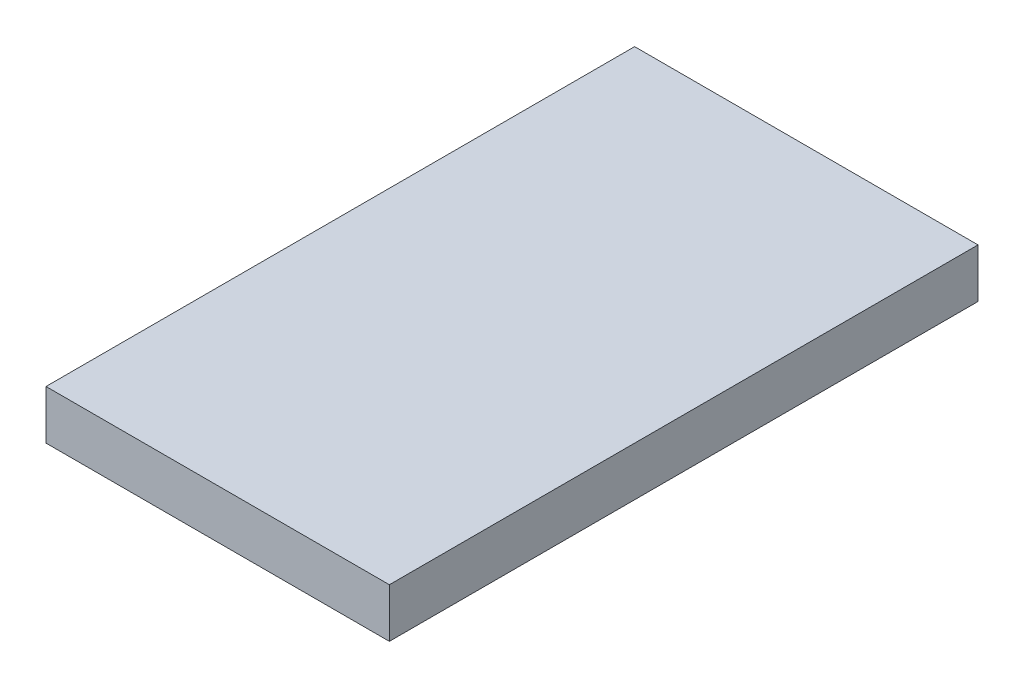
ISO-10303-21;
HEADER;
FILE_DESCRIPTION(('STEP AP214'),'2;1');
FILE_NAME('part.step','',(''),(''),'','','');
FILE_SCHEMA(('AUTOMOTIVE_DESIGN { 1 0 10303 214 1 1 1 1 }'));
ENDSEC;
DATA;
#1=APPLICATION_CONTEXT('core data for automotive mechanical design processes');
#2=APPLICATION_PROTOCOL_DEFINITION('international standard','automotive_design',2000,#1);
#3=PRODUCT_CONTEXT('',#1,'mechanical');
#4=PRODUCT('Part','Part','',(#3));
#5=PRODUCT_RELATED_PRODUCT_CATEGORY('part','',(#4));
#6=PRODUCT_DEFINITION_FORMATION('','',#4);
#7=PRODUCT_DEFINITION_CONTEXT('part definition',#1,'design');
#8=PRODUCT_DEFINITION('design','',#6,#7);
#9=PRODUCT_DEFINITION_SHAPE('','',#8);
#10=(LENGTH_UNIT() NAMED_UNIT(*) SI_UNIT(.MILLI.,.METRE.));
#11=(NAMED_UNIT(*) PLANE_ANGLE_UNIT() SI_UNIT($,.RADIAN.));
#12=(NAMED_UNIT(*) SI_UNIT($,.STERADIAN.) SOLID_ANGLE_UNIT());
#13=UNCERTAINTY_MEASURE_WITH_UNIT(LENGTH_MEASURE(1.E-05),#10,'distance_accuracy_value','');
#14=(GEOMETRIC_REPRESENTATION_CONTEXT(3) GLOBAL_UNCERTAINTY_ASSIGNED_CONTEXT((#13)) GLOBAL_UNIT_ASSIGNED_CONTEXT((#10,
#11,#12)) REPRESENTATION_CONTEXT('',''));
#15=CARTESIAN_POINT('',(0.,0.,0.));
#16=DIRECTION('',(0.,0.,1.));
#17=DIRECTION('',(1.,0.,0.));
#18=AXIS2_PLACEMENT_3D('',#15,#16,#17);
#19=CARTESIAN_POINT('',(21.,6.,-36.));
#20=DIRECTION('',(-1.,0.,0.));
#21=DIRECTION('',(0.,0.,1.));
#22=AXIS2_PLACEMENT_3D('',#19,#20,#21);
#23=PLANE('',#22);
#24=DIRECTION('',(0.,0.,-1.));
#25=VECTOR('',#24,1.);
#26=CARTESIAN_POINT('',(21.,0.,-36.));
#27=LINE('',#26,#25);
#28=CARTESIAN_POINT('',(21.,0.,36.));
#29=VERTEX_POINT('',#28);
#30=CARTESIAN_POINT('',(21.,0.,-36.));
#31=VERTEX_POINT('',#30);
#32=EDGE_CURVE('E96',#29,#31,#27,.T.);
#33=ORIENTED_EDGE('',*,*,#32,.T.);
#34=DIRECTION('',(0.,-1.,0.));
#35=VECTOR('',#34,1.);
#36=CARTESIAN_POINT('',(21.,6.,-36.));
#37=LINE('',#36,#35);
#38=CARTESIAN_POINT('',(21.,6.,-36.));
#39=VERTEX_POINT('',#38);
#40=EDGE_CURVE('E11',#39,#31,#37,.T.);
#41=ORIENTED_EDGE('',*,*,#40,.F.);
#42=DIRECTION('',(0.,0.,-1.));
#43=VECTOR('',#42,1.);
#44=CARTESIAN_POINT('',(21.,6.,-36.));
#45=LINE('',#44,#43);
#46=CARTESIAN_POINT('',(21.,6.,36.));
#47=VERTEX_POINT('',#46);
#48=EDGE_CURVE('E84',#47,#39,#45,.T.);
#49=ORIENTED_EDGE('',*,*,#48,.F.);
#50=DIRECTION('',(0.,-1.,0.));
#51=VECTOR('',#50,1.);
#52=CARTESIAN_POINT('',(21.,6.,36.));
#53=LINE('',#52,#51);
#54=EDGE_CURVE('E92',#47,#29,#53,.T.);
#55=ORIENTED_EDGE('',*,*,#54,.T.);
#56=EDGE_LOOP('',(#33,#41,#49,#55));
#57=FACE_BOUND('',#56,.T.);
#58=ADVANCED_FACE('F33',(#57),#23,.F.);
#59=CARTESIAN_POINT('',(-21.,6.,-36.));
#60=DIRECTION('',(0.,0.,1.));
#61=DIRECTION('',(1.,0.,0.));
#62=AXIS2_PLACEMENT_3D('',#59,#60,#61);
#63=PLANE('',#62);
#64=DIRECTION('',(-1.,0.,0.));
#65=VECTOR('',#64,1.);
#66=CARTESIAN_POINT('',(-21.,0.,-36.));
#67=LINE('',#66,#65);
#68=CARTESIAN_POINT('',(-21.,0.,-36.));
#69=VERTEX_POINT('',#68);
#70=EDGE_CURVE('E88',#31,#69,#67,.T.);
#71=ORIENTED_EDGE('',*,*,#70,.T.);
#72=DIRECTION('',(0.,-1.,0.));
#73=VECTOR('',#72,1.);
#74=CARTESIAN_POINT('',(-21.,6.,-36.));
#75=LINE('',#74,#73);
#76=CARTESIAN_POINT('',(-21.,6.,-36.));
#77=VERTEX_POINT('',#76);
#78=EDGE_CURVE('E41',#77,#69,#75,.T.);
#79=ORIENTED_EDGE('',*,*,#78,.F.);
#80=DIRECTION('',(-1.,0.,0.));
#81=VECTOR('',#80,1.);
#82=CARTESIAN_POINT('',(-21.,6.,-36.));
#83=LINE('',#82,#81);
#84=EDGE_CURVE('E79',#39,#77,#83,.T.);
#85=ORIENTED_EDGE('',*,*,#84,.F.);
#86=ORIENTED_EDGE('',*,*,#40,.T.);
#87=EDGE_LOOP('',(#71,#79,#85,#86));
#88=FACE_BOUND('',#87,.T.);
#89=ADVANCED_FACE('F87',(#88),#63,.F.);
#90=CARTESIAN_POINT('',(-21.,6.,-36.));
#91=DIRECTION('',(1.,0.,0.));
#92=DIRECTION('',(0.,0.,-1.));
#93=AXIS2_PLACEMENT_3D('',#90,#91,#92);
#94=PLANE('',#93);
#95=DIRECTION('',(0.,0.,1.));
#96=VECTOR('',#95,1.);
#97=CARTESIAN_POINT('',(-21.,0.,-36.));
#98=LINE('',#97,#96);
#99=CARTESIAN_POINT('',(-21.,0.,36.));
#100=VERTEX_POINT('',#99);
#101=EDGE_CURVE('E66',#69,#100,#98,.T.);
#102=ORIENTED_EDGE('',*,*,#101,.T.);
#103=DIRECTION('',(0.,-1.,0.));
#104=VECTOR('',#103,1.);
#105=CARTESIAN_POINT('',(-21.,6.,36.));
#106=LINE('',#105,#104);
#107=CARTESIAN_POINT('',(-21.,6.,36.));
#108=VERTEX_POINT('',#107);
#109=EDGE_CURVE('E89',#108,#100,#106,.T.);
#110=ORIENTED_EDGE('',*,*,#109,.F.);
#111=DIRECTION('',(0.,0.,1.));
#112=VECTOR('',#111,1.);
#113=CARTESIAN_POINT('',(-21.,6.,-36.));
#114=LINE('',#113,#112);
#115=EDGE_CURVE('E82',#77,#108,#114,.T.);
#116=ORIENTED_EDGE('',*,*,#115,.F.);
#117=ORIENTED_EDGE('',*,*,#78,.T.);
#118=EDGE_LOOP('',(#102,#110,#116,#117));
#119=FACE_BOUND('',#118,.T.);
#120=ADVANCED_FACE('F90',(#119),#94,.F.);
#121=CARTESIAN_POINT('',(-21.,6.,36.));
#122=DIRECTION('',(0.,0.,-1.));
#123=DIRECTION('',(-1.,0.,0.));
#124=AXIS2_PLACEMENT_3D('',#121,#122,#123);
#125=PLANE('',#124);
#126=DIRECTION('',(1.,0.,0.));
#127=VECTOR('',#126,1.);
#128=CARTESIAN_POINT('',(-21.,0.,36.));
#129=LINE('',#128,#127);
#130=EDGE_CURVE('E72',#100,#29,#129,.T.);
#131=ORIENTED_EDGE('',*,*,#130,.T.);
#132=ORIENTED_EDGE('',*,*,#54,.F.);
#133=DIRECTION('',(1.,0.,0.));
#134=VECTOR('',#133,1.);
#135=CARTESIAN_POINT('',(-21.,6.,36.));
#136=LINE('',#135,#134);
#137=EDGE_CURVE('E49',#108,#47,#136,.T.);
#138=ORIENTED_EDGE('',*,*,#137,.F.);
#139=ORIENTED_EDGE('',*,*,#109,.T.);
#140=EDGE_LOOP('',(#131,#132,#138,#139));
#141=FACE_BOUND('',#140,.T.);
#142=ADVANCED_FACE('F103',(#141),#125,.F.);
#143=CARTESIAN_POINT('',(0.,6.,0.));
#144=DIRECTION('',(0.,1.,0.));
#145=DIRECTION('',(0.,0.,1.));
#146=AXIS2_PLACEMENT_3D('',#143,#144,#145);
#147=PLANE('',#146);
#148=ORIENTED_EDGE('',*,*,#48,.T.);
#149=ORIENTED_EDGE('',*,*,#84,.T.);
#150=ORIENTED_EDGE('',*,*,#115,.T.);
#151=ORIENTED_EDGE('',*,*,#137,.T.);
#152=EDGE_LOOP('',(#148,#149,#150,#151));
#153=FACE_BOUND('',#152,.T.);
#154=ADVANCED_FACE('F80',(#153),#147,.T.);
#155=CARTESIAN_POINT('',(0.,0.,0.));
#156=DIRECTION('',(0.,1.,0.));
#157=DIRECTION('',(0.,0.,1.));
#158=AXIS2_PLACEMENT_3D('',#155,#156,#157);
#159=PLANE('',#158);
#160=ORIENTED_EDGE('',*,*,#32,.F.);
#161=ORIENTED_EDGE('',*,*,#130,.F.);
#162=ORIENTED_EDGE('',*,*,#101,.F.);
#163=ORIENTED_EDGE('',*,*,#70,.F.);
#164=EDGE_LOOP('',(#160,#161,#162,#163));
#165=FACE_BOUND('',#164,.T.);
#166=ADVANCED_FACE('F106',(#165),#159,.F.);
#167=CLOSED_SHELL('',(#58,#89,#120,#142,#154,#166));
#168=MANIFOLD_SOLID_BREP('B2',#167);
#169=ADVANCED_BREP_SHAPE_REPRESENTATION('',(#18,#168),#14);
#170=SHAPE_DEFINITION_REPRESENTATION(#9,#169);
ENDSEC;
END-ISO-10303-21;
